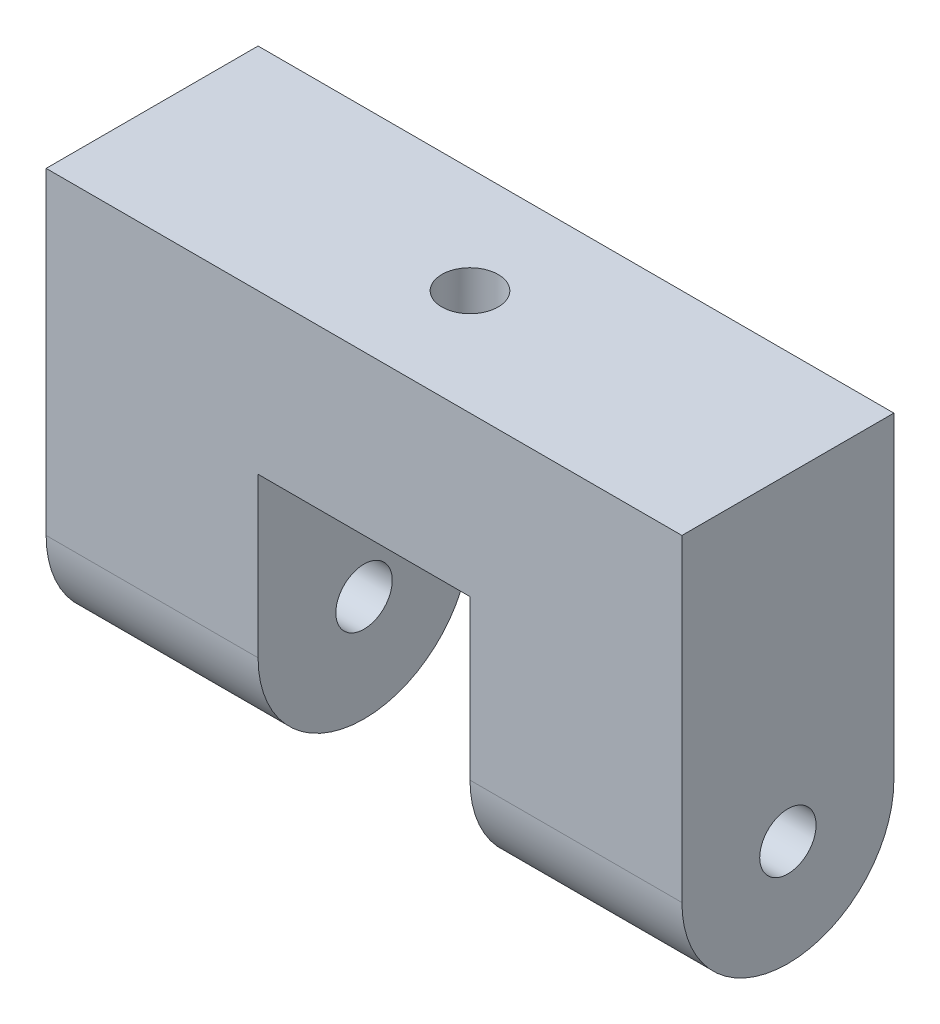
ISO-10303-21;
HEADER;
FILE_DESCRIPTION(('STEP AP214'),'2;1');
FILE_NAME('part.step','',(''),(''),'','','');
FILE_SCHEMA(('AUTOMOTIVE_DESIGN { 1 0 10303 214 1 1 1 1 }'));
ENDSEC;
DATA;
#1=APPLICATION_CONTEXT('core data for automotive mechanical design processes');
#2=APPLICATION_PROTOCOL_DEFINITION('international standard','automotive_design',2000,#1);
#3=PRODUCT_CONTEXT('',#1,'mechanical');
#4=PRODUCT('Part','Part','',(#3));
#5=PRODUCT_RELATED_PRODUCT_CATEGORY('part','',(#4));
#6=PRODUCT_DEFINITION_FORMATION('','',#4);
#7=PRODUCT_DEFINITION_CONTEXT('part definition',#1,'design');
#8=PRODUCT_DEFINITION('design','',#6,#7);
#9=PRODUCT_DEFINITION_SHAPE('','',#8);
#10=(LENGTH_UNIT() NAMED_UNIT(*) SI_UNIT(.MILLI.,.METRE.));
#11=(NAMED_UNIT(*) PLANE_ANGLE_UNIT() SI_UNIT($,.RADIAN.));
#12=(NAMED_UNIT(*) SI_UNIT($,.STERADIAN.) SOLID_ANGLE_UNIT());
#13=UNCERTAINTY_MEASURE_WITH_UNIT(LENGTH_MEASURE(1.E-05),#10,'distance_accuracy_value','');
#14=(GEOMETRIC_REPRESENTATION_CONTEXT(3) GLOBAL_UNCERTAINTY_ASSIGNED_CONTEXT((#13)) GLOBAL_UNIT_ASSIGNED_CONTEXT((#10,
#11,#12)) REPRESENTATION_CONTEXT('',''));
#15=CARTESIAN_POINT('',(0.,0.,0.));
#16=DIRECTION('',(0.,0.,1.));
#17=DIRECTION('',(1.,0.,0.));
#18=AXIS2_PLACEMENT_3D('',#15,#16,#17);
#19=CARTESIAN_POINT('',(0.,19.05,-12.7));
#20=DIRECTION('',(0.,0.,-1.));
#21=DIRECTION('',(-1.,0.,0.));
#22=AXIS2_PLACEMENT_3D('',#19,#20,#21);
#23=PLANE('',#22);
#24=DIRECTION('',(0.,-1.,0.));
#25=VECTOR('',#24,1.);
#26=CARTESIAN_POINT('',(38.1,19.05,-12.7));
#27=LINE('',#26,#25);
#28=CARTESIAN_POINT('',(38.1,19.05,-12.7));
#29=VERTEX_POINT('',#28);
#30=CARTESIAN_POINT('',(38.1,-19.05,-12.7));
#31=VERTEX_POINT('',#30);
#32=EDGE_CURVE('E306',#29,#31,#27,.T.);
#33=ORIENTED_EDGE('',*,*,#32,.T.);
#34=DIRECTION('',(1.,0.,0.));
#35=VECTOR('',#34,1.);
#36=CARTESIAN_POINT('',(12.7,-19.05,-12.7));
#37=LINE('',#36,#35);
#38=CARTESIAN_POINT('',(12.7,-19.05,-12.7));
#39=VERTEX_POINT('',#38);
#40=EDGE_CURVE('E11',#31,#39,#37,.F.);
#41=ORIENTED_EDGE('',*,*,#40,.T.);
#42=DIRECTION('',(0.,1.,0.));
#43=VECTOR('',#42,1.);
#44=CARTESIAN_POINT('',(12.7,-31.75,-12.7));
#45=LINE('',#44,#43);
#46=CARTESIAN_POINT('',(12.7,0.,-12.7));
#47=VERTEX_POINT('',#46);
#48=EDGE_CURVE('E260',#39,#47,#45,.T.);
#49=ORIENTED_EDGE('',*,*,#48,.T.);
#50=DIRECTION('',(1.,0.,0.));
#51=VECTOR('',#50,1.);
#52=CARTESIAN_POINT('',(0.,0.,-12.7));
#53=LINE('',#52,#51);
#54=CARTESIAN_POINT('',(-12.7,0.,-12.7));
#55=VERTEX_POINT('',#54);
#56=EDGE_CURVE('E281',#55,#47,#53,.T.);
#57=ORIENTED_EDGE('',*,*,#56,.F.);
#58=DIRECTION('',(0.,1.,0.));
#59=VECTOR('',#58,1.);
#60=CARTESIAN_POINT('',(-12.7,-31.75,-12.7));
#61=LINE('',#60,#59);
#62=CARTESIAN_POINT('',(-12.7,-19.05,-12.7));
#63=VERTEX_POINT('',#62);
#64=EDGE_CURVE('E271',#63,#55,#61,.T.);
#65=ORIENTED_EDGE('',*,*,#64,.F.);
#66=DIRECTION('',(1.,0.,0.));
#67=VECTOR('',#66,1.);
#68=CARTESIAN_POINT('',(-38.1,-19.05,-12.7));
#69=LINE('',#68,#67);
#70=CARTESIAN_POINT('',(-38.1,-19.05,-12.7));
#71=VERTEX_POINT('',#70);
#72=EDGE_CURVE('E51',#63,#71,#69,.F.);
#73=ORIENTED_EDGE('',*,*,#72,.T.);
#74=DIRECTION('',(0.,-1.,0.));
#75=VECTOR('',#74,1.);
#76=CARTESIAN_POINT('',(-38.1,19.05,-12.7));
#77=LINE('',#76,#75);
#78=CARTESIAN_POINT('',(-38.1,19.05,-12.7));
#79=VERTEX_POINT('',#78);
#80=EDGE_CURVE('E302',#79,#71,#77,.T.);
#81=ORIENTED_EDGE('',*,*,#80,.F.);
#82=DIRECTION('',(1.,0.,0.));
#83=VECTOR('',#82,1.);
#84=CARTESIAN_POINT('',(0.,19.05,-12.7));
#85=LINE('',#84,#83);
#86=EDGE_CURVE('E285',#79,#29,#85,.T.);
#87=ORIENTED_EDGE('',*,*,#86,.T.);
#88=EDGE_LOOP('',(#33,#41,#49,#57,#65,#73,#81,#87));
#89=FACE_BOUND('',#88,.T.);
#90=DIRECTION('',(0.,-1.,0.));
#91=VECTOR('',#90,1.);
#92=CARTESIAN_POINT('',(6.59911357683742,13.97,-12.7));
#93=LINE('',#92,#91);
#94=CARTESIAN_POINT('',(6.59911357683742,13.97,-12.7));
#95=VERTEX_POINT('',#94);
#96=CARTESIAN_POINT('',(6.59911357683742,5.08,-12.7));
#97=VERTEX_POINT('',#96);
#98=EDGE_CURVE('E217',#95,#97,#93,.T.);
#99=ORIENTED_EDGE('',*,*,#98,.F.);
#100=DIRECTION('',(1.,0.,0.));
#101=VECTOR('',#100,1.);
#102=CARTESIAN_POINT('',(0.,13.97,-12.7));
#103=LINE('',#102,#101);
#104=CARTESIAN_POINT('',(-6.59911357683742,13.97,-12.7));
#105=VERTEX_POINT('',#104);
#106=EDGE_CURVE('E167',#105,#95,#103,.T.);
#107=ORIENTED_EDGE('',*,*,#106,.F.);
#108=DIRECTION('',(0.,-1.,0.));
#109=VECTOR('',#108,1.);
#110=CARTESIAN_POINT('',(-6.59911357683742,13.97,-12.7));
#111=LINE('',#110,#109);
#112=CARTESIAN_POINT('',(-6.59911357683742,5.08,-12.7));
#113=VERTEX_POINT('',#112);
#114=EDGE_CURVE('E221',#105,#113,#111,.T.);
#115=ORIENTED_EDGE('',*,*,#114,.T.);
#116=DIRECTION('',(1.,0.,0.));
#117=VECTOR('',#116,1.);
#118=CARTESIAN_POINT('',(0.,5.08,-12.7));
#119=LINE('',#118,#117);
#120=EDGE_CURVE('E184',#113,#97,#119,.T.);
#121=ORIENTED_EDGE('',*,*,#120,.T.);
#122=EDGE_LOOP('',(#99,#107,#115,#121));
#123=FACE_BOUND('',#122,.T.);
#124=ADVANCED_FACE('F41',(#89,#123),#23,.T.);
#125=CARTESIAN_POINT('',(0.,-31.75,0.));
#126=DIRECTION('',(0.,1.,0.));
#127=DIRECTION('',(0.,0.,1.));
#128=AXIS2_PLACEMENT_3D('',#125,#126,#127);
#129=CYLINDRICAL_SURFACE('',#128,3.3782);
#130=CARTESIAN_POINT('',(0.,19.05,0.));
#131=DIRECTION('',(0.,1.,0.));
#132=DIRECTION('',(0.,0.,1.));
#133=AXIS2_PLACEMENT_3D('',#130,#131,#132);
#134=CIRCLE('',#133,3.3782);
#135=CARTESIAN_POINT('',(0.,19.05,3.3782));
#136=VERTEX_POINT('',#135);
#137=EDGE_CURVE('E233',#136,#136,#134,.T.);
#138=ORIENTED_EDGE('',*,*,#137,.T.);
#139=EDGE_LOOP('',(#138));
#140=FACE_BOUND('',#139,.T.);
#141=CARTESIAN_POINT('',(0.,13.97,0.));
#142=DIRECTION('',(0.,-1.,0.));
#143=DIRECTION('',(0.,0.,-1.));
#144=AXIS2_PLACEMENT_3D('',#141,#142,#143);
#145=CIRCLE('',#144,3.3782);
#146=CARTESIAN_POINT('',(0.,13.97,-3.3782));
#147=VERTEX_POINT('',#146);
#148=EDGE_CURVE('E45',#147,#147,#145,.F.);
#149=ORIENTED_EDGE('',*,*,#148,.F.);
#150=EDGE_LOOP('',(#149));
#151=FACE_BOUND('',#150,.T.);
#152=ADVANCED_FACE('F363',(#140,#151),#129,.F.);
#153=CARTESIAN_POINT('',(0.,0.,0.));
#154=DIRECTION('',(0.,1.,0.));
#155=DIRECTION('',(0.,0.,1.));
#156=AXIS2_PLACEMENT_3D('',#153,#154,#155);
#157=PLANE('',#156);
#158=CARTESIAN_POINT('',(0.,0.,0.));
#159=DIRECTION('',(0.,1.,0.));
#160=DIRECTION('',(0.,0.,1.));
#161=AXIS2_PLACEMENT_3D('',#158,#159,#160);
#162=CIRCLE('',#161,3.3782);
#163=CARTESIAN_POINT('',(0.,0.,3.3782));
#164=VERTEX_POINT('',#163);
#165=EDGE_CURVE('E237',#164,#164,#162,.T.);
#166=ORIENTED_EDGE('',*,*,#165,.T.);
#167=EDGE_LOOP('',(#166));
#168=FACE_BOUND('',#167,.T.);
#169=ORIENTED_EDGE('',*,*,#56,.T.);
#170=DIRECTION('',(0.,0.,1.));
#171=VECTOR('',#170,1.);
#172=CARTESIAN_POINT('',(12.7,0.,0.));
#173=LINE('',#172,#171);
#174=CARTESIAN_POINT('',(12.7,0.,12.7));
#175=VERTEX_POINT('',#174);
#176=EDGE_CURVE('E256',#47,#175,#173,.T.);
#177=ORIENTED_EDGE('',*,*,#176,.T.);
#178=DIRECTION('',(1.,0.,0.));
#179=VECTOR('',#178,1.);
#180=CARTESIAN_POINT('',(0.,0.,12.7));
#181=LINE('',#180,#179);
#182=CARTESIAN_POINT('',(-12.7,0.,12.7));
#183=VERTEX_POINT('',#182);
#184=EDGE_CURVE('E274',#183,#175,#181,.T.);
#185=ORIENTED_EDGE('',*,*,#184,.F.);
#186=DIRECTION('',(0.,0.,1.));
#187=VECTOR('',#186,1.);
#188=CARTESIAN_POINT('',(-12.7,0.,0.));
#189=LINE('',#188,#187);
#190=EDGE_CURVE('E264',#55,#183,#189,.T.);
#191=ORIENTED_EDGE('',*,*,#190,.F.);
#192=EDGE_LOOP('',(#169,#177,#185,#191));
#193=FACE_BOUND('',#192,.T.);
#194=ADVANCED_FACE('F365',(#168,#193),#157,.F.);
#195=CARTESIAN_POINT('',(0.,19.05,12.7));
#196=DIRECTION('',(0.,0.,-1.));
#197=DIRECTION('',(-1.,0.,0.));
#198=AXIS2_PLACEMENT_3D('',#195,#196,#197);
#199=PLANE('',#198);
#200=DIRECTION('',(0.,-1.,0.));
#201=VECTOR('',#200,1.);
#202=CARTESIAN_POINT('',(-38.1,19.05,12.7));
#203=LINE('',#202,#201);
#204=CARTESIAN_POINT('',(-38.1,19.05,12.7));
#205=VERTEX_POINT('',#204);
#206=CARTESIAN_POINT('',(-38.1,-19.05,12.7));
#207=VERTEX_POINT('',#206);
#208=EDGE_CURVE('E292',#205,#207,#203,.T.);
#209=ORIENTED_EDGE('',*,*,#208,.T.);
#210=DIRECTION('',(1.,0.,0.));
#211=VECTOR('',#210,1.);
#212=CARTESIAN_POINT('',(0.,-19.05,12.7));
#213=LINE('',#212,#211);
#214=CARTESIAN_POINT('',(-12.7,-19.05,12.7));
#215=VERTEX_POINT('',#214);
#216=EDGE_CURVE('E321',#207,#215,#213,.T.);
#217=ORIENTED_EDGE('',*,*,#216,.T.);
#218=DIRECTION('',(0.,1.,0.));
#219=VECTOR('',#218,1.);
#220=CARTESIAN_POINT('',(-12.7,-31.75,12.7));
#221=LINE('',#220,#219);
#222=EDGE_CURVE('E270',#215,#183,#221,.T.);
#223=ORIENTED_EDGE('',*,*,#222,.T.);
#224=ORIENTED_EDGE('',*,*,#184,.T.);
#225=DIRECTION('',(0.,1.,0.));
#226=VECTOR('',#225,1.);
#227=CARTESIAN_POINT('',(12.7,-31.75,12.7));
#228=LINE('',#227,#226);
#229=CARTESIAN_POINT('',(12.7,-19.05,12.7));
#230=VERTEX_POINT('',#229);
#231=EDGE_CURVE('E261',#230,#175,#228,.T.);
#232=ORIENTED_EDGE('',*,*,#231,.F.);
#233=DIRECTION('',(1.,0.,0.));
#234=VECTOR('',#233,1.);
#235=CARTESIAN_POINT('',(0.,-19.05,12.7));
#236=LINE('',#235,#234);
#237=CARTESIAN_POINT('',(38.1,-19.05,12.7));
#238=VERTEX_POINT('',#237);
#239=EDGE_CURVE('E314',#230,#238,#236,.T.);
#240=ORIENTED_EDGE('',*,*,#239,.T.);
#241=DIRECTION('',(0.,-1.,0.));
#242=VECTOR('',#241,1.);
#243=CARTESIAN_POINT('',(38.1,19.05,12.7));
#244=LINE('',#243,#242);
#245=CARTESIAN_POINT('',(38.1,19.05,12.7));
#246=VERTEX_POINT('',#245);
#247=EDGE_CURVE('E310',#246,#238,#244,.T.);
#248=ORIENTED_EDGE('',*,*,#247,.F.);
#249=DIRECTION('',(1.,0.,0.));
#250=VECTOR('',#249,1.);
#251=CARTESIAN_POINT('',(0.,19.05,12.7));
#252=LINE('',#251,#250);
#253=EDGE_CURVE('E277',#205,#246,#252,.T.);
#254=ORIENTED_EDGE('',*,*,#253,.F.);
#255=EDGE_LOOP('',(#209,#217,#223,#224,#232,#240,#248,#254));
#256=FACE_BOUND('',#255,.T.);
#257=ADVANCED_FACE('F373',(#256),#199,.F.);
#258=CARTESIAN_POINT('',(38.1,19.05,0.));
#259=DIRECTION('',(1.,0.,0.));
#260=DIRECTION('',(0.,0.,-1.));
#261=AXIS2_PLACEMENT_3D('',#258,#259,#260);
#262=PLANE('',#261);
#263=CARTESIAN_POINT('',(38.1,-19.05,0.));
#264=DIRECTION('',(-1.,0.,0.));
#265=DIRECTION('',(0.,0.,1.));
#266=AXIS2_PLACEMENT_3D('',#263,#264,#265);
#267=CIRCLE('',#266,3.3782);
#268=CARTESIAN_POINT('',(38.1,-19.05,3.37819999999999));
#269=VERTEX_POINT('',#268);
#270=EDGE_CURVE('E242',#269,#269,#267,.T.);
#271=ORIENTED_EDGE('',*,*,#270,.T.);
#272=EDGE_LOOP('',(#271));
#273=FACE_BOUND('',#272,.T.);
#274=ORIENTED_EDGE('',*,*,#247,.T.);
#275=CARTESIAN_POINT('',(38.1,-19.05,0.));
#276=DIRECTION('',(1.,0.,0.));
#277=DIRECTION('',(0.,0.,-1.));
#278=AXIS2_PLACEMENT_3D('',#275,#276,#277);
#279=CIRCLE('',#278,12.7);
#280=CARTESIAN_POINT('',(38.1,-31.75,0.));
#281=VERTEX_POINT('',#280);
#282=EDGE_CURVE('E340',#238,#281,#279,.T.);
#283=ORIENTED_EDGE('',*,*,#282,.T.);
#284=CARTESIAN_POINT('',(38.1,-19.05,0.));
#285=DIRECTION('',(1.,0.,0.));
#286=DIRECTION('',(0.,0.,-1.));
#287=AXIS2_PLACEMENT_3D('',#284,#285,#286);
#288=CIRCLE('',#287,12.7);
#289=EDGE_CURVE('E337',#281,#31,#288,.T.);
#290=ORIENTED_EDGE('',*,*,#289,.T.);
#291=ORIENTED_EDGE('',*,*,#32,.F.);
#292=DIRECTION('',(0.,0.,1.));
#293=VECTOR('',#292,1.);
#294=CARTESIAN_POINT('',(38.1,19.05,0.));
#295=LINE('',#294,#293);
#296=EDGE_CURVE('E280',#29,#246,#295,.T.);
#297=ORIENTED_EDGE('',*,*,#296,.T.);
#298=EDGE_LOOP('',(#274,#283,#290,#291,#297));
#299=FACE_BOUND('',#298,.T.);
#300=ADVANCED_FACE('F405',(#273,#299),#262,.T.);
#301=CARTESIAN_POINT('',(-38.1,19.05,0.));
#302=DIRECTION('',(1.,0.,0.));
#303=DIRECTION('',(0.,0.,-1.));
#304=AXIS2_PLACEMENT_3D('',#301,#302,#303);
#305=PLANE('',#304);
#306=CARTESIAN_POINT('',(-38.1,-19.05,0.));
#307=DIRECTION('',(-1.,0.,0.));
#308=DIRECTION('',(0.,0.,1.));
#309=AXIS2_PLACEMENT_3D('',#306,#307,#308);
#310=CIRCLE('',#309,3.3782);
#311=CARTESIAN_POINT('',(-38.1,-19.05,3.37819999999999));
#312=VERTEX_POINT('',#311);
#313=EDGE_CURVE('E247',#312,#312,#310,.T.);
#314=ORIENTED_EDGE('',*,*,#313,.F.);
#315=EDGE_LOOP('',(#314));
#316=FACE_BOUND('',#315,.T.);
#317=CARTESIAN_POINT('',(-38.1,-19.05,0.));
#318=DIRECTION('',(1.,0.,0.));
#319=DIRECTION('',(0.,0.,-1.));
#320=AXIS2_PLACEMENT_3D('',#317,#318,#319);
#321=CIRCLE('',#320,12.7);
#322=CARTESIAN_POINT('',(-38.1,-31.75,0.));
#323=VERTEX_POINT('',#322);
#324=EDGE_CURVE('E331',#71,#323,#321,.F.);
#325=ORIENTED_EDGE('',*,*,#324,.T.);
#326=CARTESIAN_POINT('',(-38.1,-19.05,0.));
#327=DIRECTION('',(1.,0.,0.));
#328=DIRECTION('',(0.,0.,-1.));
#329=AXIS2_PLACEMENT_3D('',#326,#327,#328);
#330=CIRCLE('',#329,12.7);
#331=EDGE_CURVE('E334',#323,#207,#330,.F.);
#332=ORIENTED_EDGE('',*,*,#331,.T.);
#333=ORIENTED_EDGE('',*,*,#208,.F.);
#334=DIRECTION('',(0.,0.,1.));
#335=VECTOR('',#334,1.);
#336=CARTESIAN_POINT('',(-38.1,19.05,0.));
#337=LINE('',#336,#335);
#338=EDGE_CURVE('E289',#79,#205,#337,.T.);
#339=ORIENTED_EDGE('',*,*,#338,.F.);
#340=ORIENTED_EDGE('',*,*,#80,.T.);
#341=EDGE_LOOP('',(#325,#332,#333,#339,#340));
#342=FACE_BOUND('',#341,.T.);
#343=ADVANCED_FACE('F430',(#316,#342),#305,.F.);
#344=CARTESIAN_POINT('',(0.,19.05,0.));
#345=DIRECTION('',(0.,1.,0.));
#346=DIRECTION('',(0.,0.,1.));
#347=AXIS2_PLACEMENT_3D('',#344,#345,#346);
#348=PLANE('',#347);
#349=ORIENTED_EDGE('',*,*,#137,.F.);
#350=EDGE_LOOP('',(#349));
#351=FACE_BOUND('',#350,.T.);
#352=ORIENTED_EDGE('',*,*,#253,.T.);
#353=ORIENTED_EDGE('',*,*,#296,.F.);
#354=ORIENTED_EDGE('',*,*,#86,.F.);
#355=ORIENTED_EDGE('',*,*,#338,.T.);
#356=EDGE_LOOP('',(#352,#353,#354,#355));
#357=FACE_BOUND('',#356,.T.);
#358=ADVANCED_FACE('F412',(#351,#357),#348,.T.);
#359=CARTESIAN_POINT('',(-12.7,-31.75,0.));
#360=DIRECTION('',(-1.,0.,0.));
#361=DIRECTION('',(0.,0.,1.));
#362=AXIS2_PLACEMENT_3D('',#359,#360,#361);
#363=PLANE('',#362);
#364=CARTESIAN_POINT('',(-12.7,-19.05,0.));
#365=DIRECTION('',(-1.,0.,0.));
#366=DIRECTION('',(0.,0.,1.));
#367=AXIS2_PLACEMENT_3D('',#364,#365,#366);
#368=CIRCLE('',#367,3.3782);
#369=CARTESIAN_POINT('',(-12.7,-19.05,3.37819999999999));
#370=VERTEX_POINT('',#369);
#371=EDGE_CURVE('E252',#370,#370,#368,.T.);
#372=ORIENTED_EDGE('',*,*,#371,.T.);
#373=EDGE_LOOP('',(#372));
#374=FACE_BOUND('',#373,.T.);
#375=ORIENTED_EDGE('',*,*,#222,.F.);
#376=CARTESIAN_POINT('',(-12.7,-19.05,0.));
#377=DIRECTION('',(-1.,0.,0.));
#378=DIRECTION('',(0.,0.,1.));
#379=AXIS2_PLACEMENT_3D('',#376,#377,#378);
#380=CIRCLE('',#379,12.7);
#381=CARTESIAN_POINT('',(-12.7,-31.75,0.));
#382=VERTEX_POINT('',#381);
#383=EDGE_CURVE('E328',#215,#382,#380,.F.);
#384=ORIENTED_EDGE('',*,*,#383,.T.);
#385=CARTESIAN_POINT('',(-12.7,-19.05,0.));
#386=DIRECTION('',(-1.,0.,0.));
#387=DIRECTION('',(0.,0.,1.));
#388=AXIS2_PLACEMENT_3D('',#385,#386,#387);
#389=CIRCLE('',#388,12.7);
#390=EDGE_CURVE('E325',#382,#63,#389,.F.);
#391=ORIENTED_EDGE('',*,*,#390,.T.);
#392=ORIENTED_EDGE('',*,*,#64,.T.);
#393=ORIENTED_EDGE('',*,*,#190,.T.);
#394=EDGE_LOOP('',(#375,#384,#391,#392,#393));
#395=FACE_BOUND('',#394,.T.);
#396=ADVANCED_FACE('F425',(#374,#395),#363,.F.);
#397=CARTESIAN_POINT('',(12.7,-31.75,0.));
#398=DIRECTION('',(-1.,0.,0.));
#399=DIRECTION('',(0.,0.,1.));
#400=AXIS2_PLACEMENT_3D('',#397,#398,#399);
#401=PLANE('',#400);
#402=CARTESIAN_POINT('',(12.7,-19.05,0.));
#403=DIRECTION('',(-1.,0.,0.));
#404=DIRECTION('',(0.,0.,1.));
#405=AXIS2_PLACEMENT_3D('',#402,#403,#404);
#406=CIRCLE('',#405,3.3782);
#407=CARTESIAN_POINT('',(12.7,-19.05,3.37819999999999));
#408=VERTEX_POINT('',#407);
#409=EDGE_CURVE('E246',#408,#408,#406,.T.);
#410=ORIENTED_EDGE('',*,*,#409,.F.);
#411=EDGE_LOOP('',(#410));
#412=FACE_BOUND('',#411,.T.);
#413=CARTESIAN_POINT('',(12.7,-19.05,0.));
#414=DIRECTION('',(-1.,0.,0.));
#415=DIRECTION('',(0.,0.,1.));
#416=AXIS2_PLACEMENT_3D('',#413,#414,#415);
#417=CIRCLE('',#416,12.7);
#418=CARTESIAN_POINT('',(12.7,-31.75,0.));
#419=VERTEX_POINT('',#418);
#420=EDGE_CURVE('E67',#39,#419,#417,.T.);
#421=ORIENTED_EDGE('',*,*,#420,.T.);
#422=CARTESIAN_POINT('',(12.7,-19.05,0.));
#423=DIRECTION('',(-1.,0.,0.));
#424=DIRECTION('',(0.,0.,1.));
#425=AXIS2_PLACEMENT_3D('',#422,#423,#424);
#426=CIRCLE('',#425,12.7);
#427=EDGE_CURVE('E345',#419,#230,#426,.T.);
#428=ORIENTED_EDGE('',*,*,#427,.T.);
#429=ORIENTED_EDGE('',*,*,#231,.T.);
#430=ORIENTED_EDGE('',*,*,#176,.F.);
#431=ORIENTED_EDGE('',*,*,#48,.F.);
#432=EDGE_LOOP('',(#421,#428,#429,#430,#431));
#433=FACE_BOUND('',#432,.T.);
#434=ADVANCED_FACE('F397',(#412,#433),#401,.T.);
#435=CARTESIAN_POINT('',(38.1,-19.05,0.));
#436=DIRECTION('',(-1.,0.,0.));
#437=DIRECTION('',(0.,0.,1.));
#438=AXIS2_PLACEMENT_3D('',#435,#436,#437);
#439=CYLINDRICAL_SURFACE('',#438,3.3782);
#440=CARTESIAN_POINT('',(12.7,-19.05,3.37819999999999));
#441=CARTESIAN_POINT('',(12.9645833333333,-19.05,3.37819999999999));
#442=CARTESIAN_POINT('',(13.2291666666667,-19.05,3.37819999999999));
#443=CARTESIAN_POINT('',(13.7583333333333,-19.05,3.37819999999999));
#444=CARTESIAN_POINT('',(14.0229166666667,-19.05,3.37819999999999));
#445=CARTESIAN_POINT('',(14.5520833333333,-19.05,3.37819999999999));
#446=CARTESIAN_POINT('',(14.8166666666667,-19.05,3.37819999999999));
#447=CARTESIAN_POINT('',(15.3458333333333,-19.05,3.37819999999999));
#448=CARTESIAN_POINT('',(15.6104166666667,-19.05,3.37819999999999));
#449=CARTESIAN_POINT('',(16.1395833333333,-19.05,3.37819999999999));
#450=CARTESIAN_POINT('',(16.4041666666667,-19.05,3.37819999999999));
#451=CARTESIAN_POINT('',(16.9333333333333,-19.05,3.37819999999999));
#452=CARTESIAN_POINT('',(17.1979166666667,-19.05,3.37819999999999));
#453=CARTESIAN_POINT('',(17.7270833333333,-19.05,3.37819999999999));
#454=CARTESIAN_POINT('',(17.9916666666667,-19.05,3.37819999999999));
#455=CARTESIAN_POINT('',(18.5208333333333,-19.05,3.37819999999999));
#456=CARTESIAN_POINT('',(18.7854166666667,-19.05,3.37819999999999));
#457=CARTESIAN_POINT('',(19.3145833333333,-19.05,3.37819999999999));
#458=CARTESIAN_POINT('',(19.5791666666667,-19.05,3.37819999999999));
#459=CARTESIAN_POINT('',(20.1083333333333,-19.05,3.37819999999999));
#460=CARTESIAN_POINT('',(20.3729166666667,-19.05,3.37819999999999));
#461=CARTESIAN_POINT('',(20.9020833333333,-19.05,3.37819999999999));
#462=CARTESIAN_POINT('',(21.1666666666667,-19.05,3.37819999999999));
#463=CARTESIAN_POINT('',(21.6958333333333,-19.05,3.37819999999999));
#464=CARTESIAN_POINT('',(21.9604166666667,-19.05,3.37819999999999));
#465=CARTESIAN_POINT('',(22.4895833333333,-19.05,3.37819999999999));
#466=CARTESIAN_POINT('',(22.7541666666667,-19.05,3.37819999999999));
#467=CARTESIAN_POINT('',(23.2833333333333,-19.05,3.37819999999999));
#468=CARTESIAN_POINT('',(23.5479166666667,-19.05,3.37819999999999));
#469=CARTESIAN_POINT('',(24.0770833333333,-19.05,3.37819999999999));
#470=CARTESIAN_POINT('',(24.3416666666667,-19.05,3.37819999999999));
#471=CARTESIAN_POINT('',(24.8708333333333,-19.05,3.37819999999999));
#472=CARTESIAN_POINT('',(25.1354166666667,-19.05,3.37819999999999));
#473=CARTESIAN_POINT('',(25.6645833333333,-19.05,3.37819999999999));
#474=CARTESIAN_POINT('',(25.9291666666667,-19.05,3.37819999999999));
#475=CARTESIAN_POINT('',(26.4583333333333,-19.05,3.37819999999999));
#476=CARTESIAN_POINT('',(26.7229166666667,-19.05,3.37819999999999));
#477=CARTESIAN_POINT('',(27.2520833333333,-19.05,3.37819999999999));
#478=CARTESIAN_POINT('',(27.5166666666667,-19.05,3.37819999999999));
#479=CARTESIAN_POINT('',(28.0458333333333,-19.05,3.37819999999999));
#480=CARTESIAN_POINT('',(28.3104166666667,-19.05,3.37819999999999));
#481=CARTESIAN_POINT('',(28.8395833333333,-19.05,3.37819999999999));
#482=CARTESIAN_POINT('',(29.1041666666667,-19.05,3.37819999999999));
#483=CARTESIAN_POINT('',(29.6333333333333,-19.05,3.37819999999999));
#484=CARTESIAN_POINT('',(29.8979166666667,-19.05,3.37819999999999));
#485=CARTESIAN_POINT('',(30.4270833333333,-19.05,3.37819999999999));
#486=CARTESIAN_POINT('',(30.6916666666667,-19.05,3.37819999999999));
#487=CARTESIAN_POINT('',(31.2208333333333,-19.05,3.37819999999999));
#488=CARTESIAN_POINT('',(31.4854166666667,-19.05,3.37819999999999));
#489=CARTESIAN_POINT('',(32.0145833333333,-19.05,3.37819999999999));
#490=CARTESIAN_POINT('',(32.2791666666667,-19.05,3.37819999999999));
#491=CARTESIAN_POINT('',(32.8083333333333,-19.05,3.37819999999999));
#492=CARTESIAN_POINT('',(33.0729166666667,-19.05,3.37819999999999));
#493=CARTESIAN_POINT('',(33.6020833333333,-19.05,3.37819999999999));
#494=CARTESIAN_POINT('',(33.8666666666667,-19.05,3.37819999999999));
#495=CARTESIAN_POINT('',(34.3958333333333,-19.05,3.37819999999999));
#496=CARTESIAN_POINT('',(34.6604166666667,-19.05,3.37819999999999));
#497=CARTESIAN_POINT('',(35.1895833333333,-19.05,3.37819999999999));
#498=CARTESIAN_POINT('',(35.4541666666667,-19.05,3.37819999999999));
#499=CARTESIAN_POINT('',(35.9833333333333,-19.05,3.37819999999999));
#500=CARTESIAN_POINT('',(36.2479166666667,-19.05,3.37819999999999));
#501=CARTESIAN_POINT('',(36.7770833333333,-19.05,3.37819999999999));
#502=CARTESIAN_POINT('',(37.0416666666667,-19.05,3.37819999999999));
#503=CARTESIAN_POINT('',(37.5708333333333,-19.05,3.37819999999999));
#504=CARTESIAN_POINT('',(37.8354166666667,-19.05,3.37819999999999));
#505=CARTESIAN_POINT('',(38.1,-19.05,3.37819999999999));
#506=B_SPLINE_CURVE_WITH_KNOTS('',3,(#440,#441,#442,#443,#444,#445,#446,#447,#448,#449,#450,
#451,#452,#453,#454,#455,#456,#457,#458,#459,#460,#461,#462,#463,#464,#465,#466,#467,#468,#469,
#470,#471,#472,#473,#474,#475,#476,#477,#478,#479,#480,#481,#482,#483,#484,#485,#486,#487,#488,
#489,#490,#491,#492,#493,#494,#495,#496,#497,#498,#499,#500,#501,#502,#503,#504,#505),
.UNSPECIFIED.,.F.,.F.,(4,2,2,2,2,2,2,2,2,2,2,2,2,2,2,2,2,2,2,2,2,2,2,2,2,2,2,2,2,2,2,2,4),(0.,
0.793749999999999,1.5875,2.38125,3.175,3.96875,4.7625,5.55625,6.35,7.14375,7.9375,8.73125,9.525,
10.31875,11.1125,11.90625,12.7,13.49375,14.2875,15.08125,15.875,16.66875,17.4625,18.25625,19.05,
19.84375,20.6375,21.43125,22.225,23.01875,23.8125,24.60625,25.4),.UNSPECIFIED.);
#507=EDGE_CURVE('BSEAM453',#408,#269,#506,.T.);
#508=ORIENTED_EDGE('',*,*,#409,.T.);
#509=ORIENTED_EDGE('',*,*,#270,.F.);
#510=ORIENTED_EDGE('',*,*,#507,.T.);
#511=ORIENTED_EDGE('',*,*,#507,.F.);
#512=EDGE_LOOP('',(#508,#510,#509,#511));
#513=FACE_BOUND('',#512,.T.);
#514=ADVANCED_FACE('F453',(#513),#439,.F.);
#515=CARTESIAN_POINT('',(-38.1,-19.05,3.37819999999999));
#516=CARTESIAN_POINT('',(-37.8354166666667,-19.05,3.37819999999999));
#517=CARTESIAN_POINT('',(-37.5708333333333,-19.05,3.37819999999999));
#518=CARTESIAN_POINT('',(-37.0416666666667,-19.05,3.37819999999999));
#519=CARTESIAN_POINT('',(-36.7770833333333,-19.05,3.37819999999999));
#520=CARTESIAN_POINT('',(-36.2479166666667,-19.05,3.37819999999999));
#521=CARTESIAN_POINT('',(-35.9833333333333,-19.05,3.37819999999999));
#522=CARTESIAN_POINT('',(-35.4541666666667,-19.05,3.37819999999999));
#523=CARTESIAN_POINT('',(-35.1895833333333,-19.05,3.37819999999999));
#524=CARTESIAN_POINT('',(-34.6604166666667,-19.05,3.37819999999999));
#525=CARTESIAN_POINT('',(-34.3958333333333,-19.05,3.37819999999999));
#526=CARTESIAN_POINT('',(-33.8666666666667,-19.05,3.37819999999999));
#527=CARTESIAN_POINT('',(-33.6020833333333,-19.05,3.37819999999999));
#528=CARTESIAN_POINT('',(-33.0729166666667,-19.05,3.37819999999999));
#529=CARTESIAN_POINT('',(-32.8083333333333,-19.05,3.37819999999999));
#530=CARTESIAN_POINT('',(-32.2791666666667,-19.05,3.37819999999999));
#531=CARTESIAN_POINT('',(-32.0145833333333,-19.05,3.37819999999999));
#532=CARTESIAN_POINT('',(-31.4854166666667,-19.05,3.37819999999999));
#533=CARTESIAN_POINT('',(-31.2208333333333,-19.05,3.37819999999999));
#534=CARTESIAN_POINT('',(-30.6916666666667,-19.05,3.37819999999999));
#535=CARTESIAN_POINT('',(-30.4270833333333,-19.05,3.37819999999999));
#536=CARTESIAN_POINT('',(-29.8979166666667,-19.05,3.37819999999999));
#537=CARTESIAN_POINT('',(-29.6333333333333,-19.05,3.37819999999999));
#538=CARTESIAN_POINT('',(-29.1041666666667,-19.05,3.37819999999999));
#539=CARTESIAN_POINT('',(-28.8395833333333,-19.05,3.37819999999999));
#540=CARTESIAN_POINT('',(-28.3104166666667,-19.05,3.37819999999999));
#541=CARTESIAN_POINT('',(-28.0458333333333,-19.05,3.37819999999999));
#542=CARTESIAN_POINT('',(-27.5166666666667,-19.05,3.37819999999999));
#543=CARTESIAN_POINT('',(-27.2520833333333,-19.05,3.37819999999999));
#544=CARTESIAN_POINT('',(-26.7229166666667,-19.05,3.37819999999999));
#545=CARTESIAN_POINT('',(-26.4583333333333,-19.05,3.37819999999999));
#546=CARTESIAN_POINT('',(-25.9291666666667,-19.05,3.37819999999999));
#547=CARTESIAN_POINT('',(-25.6645833333333,-19.05,3.37819999999999));
#548=CARTESIAN_POINT('',(-25.1354166666667,-19.05,3.37819999999999));
#549=CARTESIAN_POINT('',(-24.8708333333333,-19.05,3.37819999999999));
#550=CARTESIAN_POINT('',(-24.3416666666667,-19.05,3.37819999999999));
#551=CARTESIAN_POINT('',(-24.0770833333333,-19.05,3.37819999999999));
#552=CARTESIAN_POINT('',(-23.5479166666667,-19.05,3.37819999999999));
#553=CARTESIAN_POINT('',(-23.2833333333333,-19.05,3.37819999999999));
#554=CARTESIAN_POINT('',(-22.7541666666667,-19.05,3.37819999999999));
#555=CARTESIAN_POINT('',(-22.4895833333333,-19.05,3.37819999999999));
#556=CARTESIAN_POINT('',(-21.9604166666667,-19.05,3.37819999999999));
#557=CARTESIAN_POINT('',(-21.6958333333333,-19.05,3.37819999999999));
#558=CARTESIAN_POINT('',(-21.1666666666667,-19.05,3.37819999999999));
#559=CARTESIAN_POINT('',(-20.9020833333333,-19.05,3.37819999999999));
#560=CARTESIAN_POINT('',(-20.3729166666667,-19.05,3.37819999999999));
#561=CARTESIAN_POINT('',(-20.1083333333333,-19.05,3.37819999999999));
#562=CARTESIAN_POINT('',(-19.5791666666667,-19.05,3.37819999999999));
#563=CARTESIAN_POINT('',(-19.3145833333333,-19.05,3.37819999999999));
#564=CARTESIAN_POINT('',(-18.7854166666667,-19.05,3.37819999999999));
#565=CARTESIAN_POINT('',(-18.5208333333333,-19.05,3.37819999999999));
#566=CARTESIAN_POINT('',(-17.9916666666667,-19.05,3.37819999999999));
#567=CARTESIAN_POINT('',(-17.7270833333333,-19.05,3.37819999999999));
#568=CARTESIAN_POINT('',(-17.1979166666667,-19.05,3.37819999999999));
#569=CARTESIAN_POINT('',(-16.9333333333333,-19.05,3.37819999999999));
#570=CARTESIAN_POINT('',(-16.4041666666667,-19.05,3.37819999999999));
#571=CARTESIAN_POINT('',(-16.1395833333333,-19.05,3.37819999999999));
#572=CARTESIAN_POINT('',(-15.6104166666667,-19.05,3.37819999999999));
#573=CARTESIAN_POINT('',(-15.3458333333333,-19.05,3.37819999999999));
#574=CARTESIAN_POINT('',(-14.8166666666667,-19.05,3.37819999999999));
#575=CARTESIAN_POINT('',(-14.5520833333333,-19.05,3.37819999999999));
#576=CARTESIAN_POINT('',(-14.0229166666667,-19.05,3.37819999999999));
#577=CARTESIAN_POINT('',(-13.7583333333333,-19.05,3.37819999999999));
#578=CARTESIAN_POINT('',(-13.2291666666667,-19.05,3.37819999999999));
#579=CARTESIAN_POINT('',(-12.9645833333333,-19.05,3.37819999999999));
#580=CARTESIAN_POINT('',(-12.7,-19.05,3.37819999999999));
#581=B_SPLINE_CURVE_WITH_KNOTS('',3,(#515,#516,#517,#518,#519,#520,#521,#522,#523,#524,#525,
#526,#527,#528,#529,#530,#531,#532,#533,#534,#535,#536,#537,#538,#539,#540,#541,#542,#543,#544,
#545,#546,#547,#548,#549,#550,#551,#552,#553,#554,#555,#556,#557,#558,#559,#560,#561,#562,#563,
#564,#565,#566,#567,#568,#569,#570,#571,#572,#573,#574,#575,#576,#577,#578,#579,#580),
.UNSPECIFIED.,.F.,.F.,(4,2,2,2,2,2,2,2,2,2,2,2,2,2,2,2,2,2,2,2,2,2,2,2,2,2,2,2,2,2,2,2,4),(0.,
0.793749999999996,1.58750000000001,2.38125,3.175,3.96875000000001,4.7625,5.55625,
6.34999999999999,7.14375,7.9375,8.73125,9.52500000000001,10.31875,11.1125,11.90625,12.7,
13.49375,14.2875,15.08125,15.875,16.66875,17.4625,18.25625,19.05,19.84375,20.6375,21.43125,
22.225,23.01875,23.8125,24.60625,25.4),.UNSPECIFIED.);
#582=EDGE_CURVE('BSEAM449',#312,#370,#581,.T.);
#583=ORIENTED_EDGE('',*,*,#313,.T.);
#584=ORIENTED_EDGE('',*,*,#371,.F.);
#585=ORIENTED_EDGE('',*,*,#582,.T.);
#586=ORIENTED_EDGE('',*,*,#582,.F.);
#587=EDGE_LOOP('',(#583,#585,#584,#586));
#588=FACE_BOUND('',#587,.T.);
#589=ADVANCED_FACE('F449',(#588),#439,.F.);
#590=CARTESIAN_POINT('',(0.,-19.05,0.));
#591=DIRECTION('',(-1.,0.,0.));
#592=DIRECTION('',(0.,0.,1.));
#593=AXIS2_PLACEMENT_3D('',#590,#591,#592);
#594=CYLINDRICAL_SURFACE('',#593,12.7);
#595=DIRECTION('',(1.,0.,0.));
#596=VECTOR('',#595,1.);
#597=CARTESIAN_POINT('',(-12.7,-31.75,0.));
#598=LINE('',#597,#596);
#599=EDGE_CURVE('E251',#323,#382,#598,.T.);
#600=ORIENTED_EDGE('',*,*,#599,.F.);
#601=ORIENTED_EDGE('',*,*,#324,.F.);
#602=ORIENTED_EDGE('',*,*,#72,.F.);
#603=ORIENTED_EDGE('',*,*,#390,.F.);
#604=EDGE_LOOP('',(#600,#601,#602,#603));
#605=FACE_BOUND('',#604,.T.);
#606=ADVANCED_FACE('F428',(#605),#594,.T.);
#607=CARTESIAN_POINT('',(0.,-19.05,0.));
#608=DIRECTION('',(1.,0.,0.));
#609=DIRECTION('',(0.,0.,-1.));
#610=AXIS2_PLACEMENT_3D('',#607,#608,#609);
#611=CYLINDRICAL_SURFACE('',#610,12.7);
#612=ORIENTED_EDGE('',*,*,#331,.F.);
#613=ORIENTED_EDGE('',*,*,#599,.T.);
#614=ORIENTED_EDGE('',*,*,#383,.F.);
#615=ORIENTED_EDGE('',*,*,#216,.F.);
#616=EDGE_LOOP('',(#612,#613,#614,#615));
#617=FACE_BOUND('',#616,.T.);
#618=ADVANCED_FACE('F421',(#617),#611,.T.);
#619=CARTESIAN_POINT('',(0.,-19.05,0.));
#620=DIRECTION('',(-1.,0.,0.));
#621=DIRECTION('',(0.,0.,1.));
#622=AXIS2_PLACEMENT_3D('',#619,#620,#621);
#623=CYLINDRICAL_SURFACE('',#622,12.7);
#624=DIRECTION('',(1.,0.,0.));
#625=VECTOR('',#624,1.);
#626=CARTESIAN_POINT('',(38.1,-31.75,0.));
#627=LINE('',#626,#625);
#628=EDGE_CURVE('E241',#419,#281,#627,.T.);
#629=ORIENTED_EDGE('',*,*,#628,.F.);
#630=ORIENTED_EDGE('',*,*,#420,.F.);
#631=ORIENTED_EDGE('',*,*,#40,.F.);
#632=ORIENTED_EDGE('',*,*,#289,.F.);
#633=EDGE_LOOP('',(#629,#630,#631,#632));
#634=FACE_BOUND('',#633,.T.);
#635=ADVANCED_FACE('F43',(#634),#623,.T.);
#636=CARTESIAN_POINT('',(0.,-19.05,0.));
#637=DIRECTION('',(1.,0.,0.));
#638=DIRECTION('',(0.,0.,-1.));
#639=AXIS2_PLACEMENT_3D('',#636,#637,#638);
#640=CYLINDRICAL_SURFACE('',#639,12.7);
#641=ORIENTED_EDGE('',*,*,#427,.F.);
#642=ORIENTED_EDGE('',*,*,#628,.T.);
#643=ORIENTED_EDGE('',*,*,#282,.F.);
#644=ORIENTED_EDGE('',*,*,#239,.F.);
#645=EDGE_LOOP('',(#641,#642,#643,#644));
#646=FACE_BOUND('',#645,.T.);
#647=ADVANCED_FACE('F381',(#646),#640,.T.);
#648=CARTESIAN_POINT('',(0.,5.08,0.));
#649=DIRECTION('',(0.,-1.,0.));
#650=DIRECTION('',(0.,0.,-1.));
#651=AXIS2_PLACEMENT_3D('',#648,#649,#650);
#652=CIRCLE('',#651,3.3782);
#653=CARTESIAN_POINT('',(0.,5.08,-3.3782));
#654=VERTEX_POINT('',#653);
#655=EDGE_CURVE('E220',#654,#654,#652,.F.);
#656=ORIENTED_EDGE('',*,*,#655,.T.);
#657=EDGE_LOOP('',(#656));
#658=FACE_BOUND('',#657,.T.);
#659=ORIENTED_EDGE('',*,*,#165,.F.);
#660=EDGE_LOOP('',(#659));
#661=FACE_BOUND('',#660,.T.);
#662=ADVANCED_FACE('F368',(#658,#661),#129,.F.);
#663=CARTESIAN_POINT('',(0.,13.97,0.));
#664=DIRECTION('',(0.,-1.,0.));
#665=DIRECTION('',(0.,0.,-1.));
#666=AXIS2_PLACEMENT_3D('',#663,#664,#665);
#667=PLANE('',#666);
#668=DIRECTION('',(0.,0.,1.));
#669=VECTOR('',#668,1.);
#670=CARTESIAN_POINT('',(6.59911357683742,13.97,0.));
#671=LINE('',#670,#669);
#672=CARTESIAN_POINT('',(6.59911357683742,13.97,0.));
#673=VERTEX_POINT('',#672);
#674=EDGE_CURVE('E161',#95,#673,#671,.T.);
#675=ORIENTED_EDGE('',*,*,#674,.T.);
#676=DIRECTION('',(-0.5,0.,0.866025403784439));
#677=VECTOR('',#676,1.);
#678=CARTESIAN_POINT('',(4.94933518262807,13.97,2.8575));
#679=LINE('',#678,#677);
#680=CARTESIAN_POINT('',(3.29955678841871,13.97,5.715));
#681=VERTEX_POINT('',#680);
#682=EDGE_CURVE('E170',#673,#681,#679,.T.);
#683=ORIENTED_EDGE('',*,*,#682,.T.);
#684=DIRECTION('',(-1.,0.,0.));
#685=VECTOR('',#684,1.);
#686=CARTESIAN_POINT('',(0.,13.97,5.715));
#687=LINE('',#686,#685);
#688=CARTESIAN_POINT('',(-3.29955678841871,13.97,5.715));
#689=VERTEX_POINT('',#688);
#690=EDGE_CURVE('E176',#681,#689,#687,.T.);
#691=ORIENTED_EDGE('',*,*,#690,.T.);
#692=DIRECTION('',(-0.5,0.,-0.866025403784439));
#693=VECTOR('',#692,1.);
#694=CARTESIAN_POINT('',(-4.94933518262807,13.97,2.8575));
#695=LINE('',#694,#693);
#696=CARTESIAN_POINT('',(-6.59911357683742,13.97,0.));
#697=VERTEX_POINT('',#696);
#698=EDGE_CURVE('E193',#689,#697,#695,.T.);
#699=ORIENTED_EDGE('',*,*,#698,.T.);
#700=DIRECTION('',(0.,0.,-1.));
#701=VECTOR('',#700,1.);
#702=CARTESIAN_POINT('',(-6.59911357683742,13.97,0.));
#703=LINE('',#702,#701);
#704=EDGE_CURVE('E197',#697,#105,#703,.T.);
#705=ORIENTED_EDGE('',*,*,#704,.T.);
#706=ORIENTED_EDGE('',*,*,#106,.T.);
#707=EDGE_LOOP('',(#675,#683,#691,#699,#705,#706));
#708=FACE_BOUND('',#707,.T.);
#709=ORIENTED_EDGE('',*,*,#148,.T.);
#710=EDGE_LOOP('',(#709));
#711=FACE_BOUND('',#710,.T.);
#712=ADVANCED_FACE('F178',(#708,#711),#667,.T.);
#713=CARTESIAN_POINT('',(0.,5.08,0.));
#714=DIRECTION('',(0.,-1.,0.));
#715=DIRECTION('',(0.,0.,-1.));
#716=AXIS2_PLACEMENT_3D('',#713,#714,#715);
#717=PLANE('',#716);
#718=DIRECTION('',(0.,0.,1.));
#719=VECTOR('',#718,1.);
#720=CARTESIAN_POINT('',(6.59911357683742,5.08,0.));
#721=LINE('',#720,#719);
#722=CARTESIAN_POINT('',(6.59911357683742,5.08,0.));
#723=VERTEX_POINT('',#722);
#724=EDGE_CURVE('E59',#97,#723,#721,.T.);
#725=ORIENTED_EDGE('',*,*,#724,.F.);
#726=ORIENTED_EDGE('',*,*,#120,.F.);
#727=DIRECTION('',(0.,0.,-1.));
#728=VECTOR('',#727,1.);
#729=CARTESIAN_POINT('',(-6.59911357683742,5.08,0.));
#730=LINE('',#729,#728);
#731=CARTESIAN_POINT('',(-6.59911357683742,5.08,0.));
#732=VERTEX_POINT('',#731);
#733=EDGE_CURVE('E188',#732,#113,#730,.T.);
#734=ORIENTED_EDGE('',*,*,#733,.F.);
#735=DIRECTION('',(-0.5,0.,-0.866025403784439));
#736=VECTOR('',#735,1.);
#737=CARTESIAN_POINT('',(-4.94933518262807,5.08,2.8575));
#738=LINE('',#737,#736);
#739=CARTESIAN_POINT('',(-3.29955678841871,5.08,5.715));
#740=VERTEX_POINT('',#739);
#741=EDGE_CURVE('E211',#740,#732,#738,.T.);
#742=ORIENTED_EDGE('',*,*,#741,.F.);
#743=DIRECTION('',(-1.,0.,0.));
#744=VECTOR('',#743,1.);
#745=CARTESIAN_POINT('',(0.,5.08,5.715));
#746=LINE('',#745,#744);
#747=CARTESIAN_POINT('',(3.29955678841871,5.08,5.715));
#748=VERTEX_POINT('',#747);
#749=EDGE_CURVE('E207',#748,#740,#746,.T.);
#750=ORIENTED_EDGE('',*,*,#749,.F.);
#751=DIRECTION('',(-0.5,0.,0.866025403784439));
#752=VECTOR('',#751,1.);
#753=CARTESIAN_POINT('',(4.94933518262807,5.08,2.8575));
#754=LINE('',#753,#752);
#755=EDGE_CURVE('E204',#723,#748,#754,.T.);
#756=ORIENTED_EDGE('',*,*,#755,.F.);
#757=EDGE_LOOP('',(#725,#726,#734,#742,#750,#756));
#758=FACE_BOUND('',#757,.T.);
#759=ORIENTED_EDGE('',*,*,#655,.F.);
#760=EDGE_LOOP('',(#759));
#761=FACE_BOUND('',#760,.T.);
#762=ADVANCED_FACE('F386',(#758,#761),#717,.F.);
#763=CARTESIAN_POINT('',(6.59911357683742,13.97,0.));
#764=DIRECTION('',(1.,0.,0.));
#765=DIRECTION('',(0.,0.,-1.));
#766=AXIS2_PLACEMENT_3D('',#763,#764,#765);
#767=PLANE('',#766);
#768=ORIENTED_EDGE('',*,*,#724,.T.);
#769=DIRECTION('',(0.,-1.,0.));
#770=VECTOR('',#769,1.);
#771=CARTESIAN_POINT('',(6.59911357683742,13.97,0.));
#772=LINE('',#771,#770);
#773=EDGE_CURVE('E157',#673,#723,#772,.T.);
#774=ORIENTED_EDGE('',*,*,#773,.F.);
#775=ORIENTED_EDGE('',*,*,#674,.F.);
#776=ORIENTED_EDGE('',*,*,#98,.T.);
#777=EDGE_LOOP('',(#768,#774,#775,#776));
#778=FACE_BOUND('',#777,.T.);
#779=ADVANCED_FACE('F159',(#778),#767,.F.);
#780=CARTESIAN_POINT('',(-6.59911357683742,13.97,0.));
#781=DIRECTION('',(-1.,0.,0.));
#782=DIRECTION('',(0.,0.,1.));
#783=AXIS2_PLACEMENT_3D('',#780,#781,#782);
#784=PLANE('',#783);
#785=ORIENTED_EDGE('',*,*,#733,.T.);
#786=ORIENTED_EDGE('',*,*,#114,.F.);
#787=ORIENTED_EDGE('',*,*,#704,.F.);
#788=DIRECTION('',(0.,-1.,0.));
#789=VECTOR('',#788,1.);
#790=CARTESIAN_POINT('',(-6.59911357683742,13.97,0.));
#791=LINE('',#790,#789);
#792=EDGE_CURVE('E225',#697,#732,#791,.T.);
#793=ORIENTED_EDGE('',*,*,#792,.T.);
#794=EDGE_LOOP('',(#785,#786,#787,#793));
#795=FACE_BOUND('',#794,.T.);
#796=ADVANCED_FACE('F607',(#795),#784,.F.);
#797=CARTESIAN_POINT('',(-4.94933518262807,13.97,2.8575));
#798=DIRECTION('',(-0.866025403784439,0.,0.5));
#799=DIRECTION('',(0.5,0.,0.866025403784439));
#800=AXIS2_PLACEMENT_3D('',#797,#798,#799);
#801=PLANE('',#800);
#802=ORIENTED_EDGE('',*,*,#741,.T.);
#803=ORIENTED_EDGE('',*,*,#792,.F.);
#804=ORIENTED_EDGE('',*,*,#698,.F.);
#805=DIRECTION('',(0.,-1.,0.));
#806=VECTOR('',#805,1.);
#807=CARTESIAN_POINT('',(-3.29955678841871,13.97,5.715));
#808=LINE('',#807,#806);
#809=EDGE_CURVE('E228',#689,#740,#808,.T.);
#810=ORIENTED_EDGE('',*,*,#809,.T.);
#811=EDGE_LOOP('',(#802,#803,#804,#810));
#812=FACE_BOUND('',#811,.T.);
#813=ADVANCED_FACE('F614',(#812),#801,.F.);
#814=CARTESIAN_POINT('',(0.,13.97,5.715));
#815=DIRECTION('',(0.,0.,1.));
#816=DIRECTION('',(1.,0.,0.));
#817=AXIS2_PLACEMENT_3D('',#814,#815,#816);
#818=PLANE('',#817);
#819=ORIENTED_EDGE('',*,*,#749,.T.);
#820=ORIENTED_EDGE('',*,*,#809,.F.);
#821=ORIENTED_EDGE('',*,*,#690,.F.);
#822=DIRECTION('',(0.,-1.,0.));
#823=VECTOR('',#822,1.);
#824=CARTESIAN_POINT('',(3.29955678841871,13.97,5.715));
#825=LINE('',#824,#823);
#826=EDGE_CURVE('E166',#681,#748,#825,.T.);
#827=ORIENTED_EDGE('',*,*,#826,.T.);
#828=EDGE_LOOP('',(#819,#820,#821,#827));
#829=FACE_BOUND('',#828,.T.);
#830=ADVANCED_FACE('F623',(#829),#818,.F.);
#831=CARTESIAN_POINT('',(4.94933518262807,13.97,2.8575));
#832=DIRECTION('',(0.866025403784438,0.,0.5));
#833=DIRECTION('',(0.5,0.,-0.866025403784439));
#834=AXIS2_PLACEMENT_3D('',#831,#832,#833);
#835=PLANE('',#834);
#836=ORIENTED_EDGE('',*,*,#755,.T.);
#837=ORIENTED_EDGE('',*,*,#826,.F.);
#838=ORIENTED_EDGE('',*,*,#682,.F.);
#839=ORIENTED_EDGE('',*,*,#773,.T.);
#840=EDGE_LOOP('',(#836,#837,#838,#839));
#841=FACE_BOUND('',#840,.T.);
#842=ADVANCED_FACE('F171',(#841),#835,.F.);
#843=CLOSED_SHELL('',(#124,#152,#194,#257,#300,#343,#358,#396,#434,#514,#589,#606,#618,#635,
#647,#662,#712,#762,#779,#796,#813,#830,#842));
#844=MANIFOLD_SOLID_BREP('B2',#843);
#845=ADVANCED_BREP_SHAPE_REPRESENTATION('',(#18,#844),#14);
#846=SHAPE_DEFINITION_REPRESENTATION(#9,#845);
ENDSEC;
END-ISO-10303-21;
